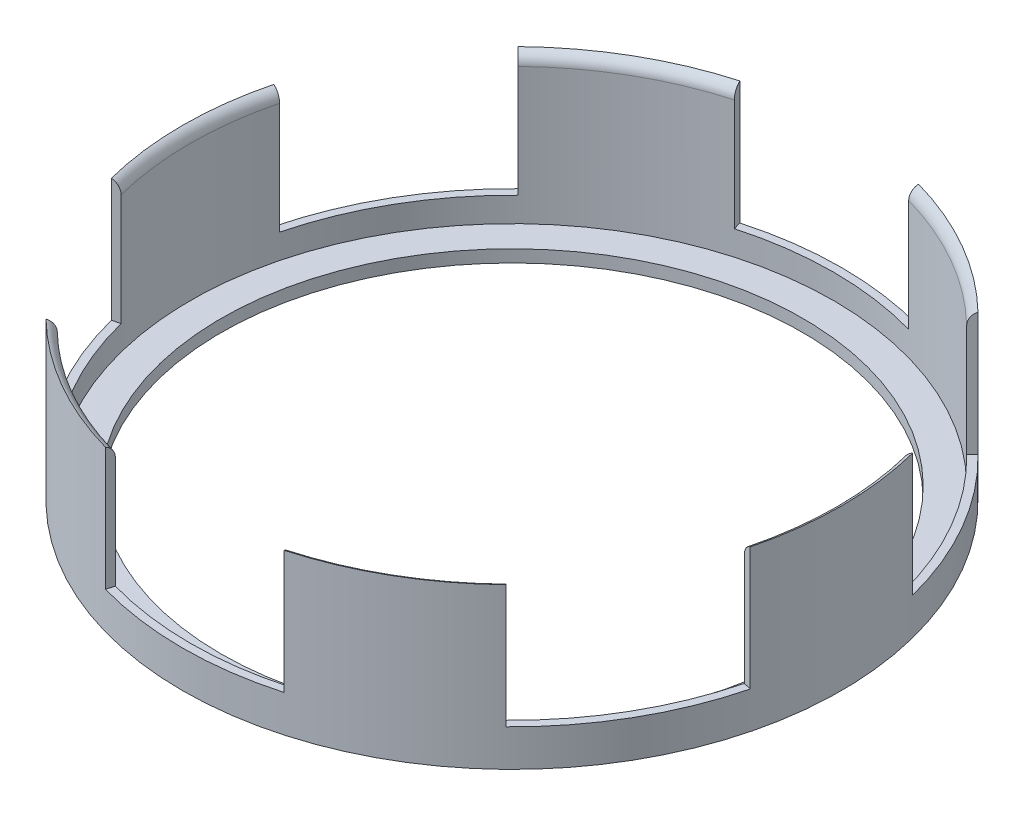
ISO-10303-21;
HEADER;
FILE_DESCRIPTION(('STEP AP214'),'2;1');
FILE_NAME('part.step','',(''),(''),'','','');
FILE_SCHEMA(('AUTOMOTIVE_DESIGN { 1 0 10303 214 1 1 1 1 }'));
ENDSEC;
DATA;
#1=APPLICATION_CONTEXT('core data for automotive mechanical design processes');
#2=APPLICATION_PROTOCOL_DEFINITION('international standard','automotive_design',2000,#1);
#3=PRODUCT_CONTEXT('',#1,'mechanical');
#4=PRODUCT('Part','Part','',(#3));
#5=PRODUCT_RELATED_PRODUCT_CATEGORY('part','',(#4));
#6=PRODUCT_DEFINITION_FORMATION('','',#4);
#7=PRODUCT_DEFINITION_CONTEXT('part definition',#1,'design');
#8=PRODUCT_DEFINITION('design','',#6,#7);
#9=PRODUCT_DEFINITION_SHAPE('','',#8);
#10=(LENGTH_UNIT() NAMED_UNIT(*) SI_UNIT(.MILLI.,.METRE.));
#11=(NAMED_UNIT(*) PLANE_ANGLE_UNIT() SI_UNIT($,.RADIAN.));
#12=(NAMED_UNIT(*) SI_UNIT($,.STERADIAN.) SOLID_ANGLE_UNIT());
#13=UNCERTAINTY_MEASURE_WITH_UNIT(LENGTH_MEASURE(1.E-05),#10,'distance_accuracy_value','');
#14=(GEOMETRIC_REPRESENTATION_CONTEXT(3) GLOBAL_UNCERTAINTY_ASSIGNED_CONTEXT((#13)) GLOBAL_UNIT_ASSIGNED_CONTEXT((#10,
#11,#12)) REPRESENTATION_CONTEXT('',''));
#15=CARTESIAN_POINT('',(0.,0.,0.));
#16=DIRECTION('',(0.,0.,1.));
#17=DIRECTION('',(1.,0.,0.));
#18=AXIS2_PLACEMENT_3D('',#15,#16,#17);
#19=CARTESIAN_POINT('',(26.775,3.,0.));
#20=DIRECTION('',(0.,1.,0.));
#21=DIRECTION('',(0.,0.,1.));
#22=AXIS2_PLACEMENT_3D('',#19,#20,#21);
#23=PLANE('',#22);
#24=CARTESIAN_POINT('',(0.,3.,0.));
#25=DIRECTION('',(0.,-1.,0.));
#26=DIRECTION('',(0.,0.,-1.));
#27=AXIS2_PLACEMENT_3D('',#24,#25,#26);
#28=CIRCLE('',#27,26.125);
#29=CARTESIAN_POINT('',(-7.08242283202688,3.,-25.1466680064852));
#30=VERTEX_POINT('',#29);
#31=CARTESIAN_POINT('',(7.0824228320274,3.00000000000001,-25.146668006485));
#32=VERTEX_POINT('',#31);
#33=EDGE_CURVE('E455',#30,#32,#28,.T.);
#34=ORIENTED_EDGE('',*,*,#33,.T.);
#35=DIRECTION('',(0.271097524670905,0.,-0.962551885415694));
#36=VECTOR('',#35,1.);
#37=CARTESIAN_POINT('',(1.96779831255908,3.,-6.98681398205641));
#38=LINE('',#37,#36);
#39=CARTESIAN_POINT('',(7.25863622306349,3.00000000000001,-25.7723267320052));
#40=VERTEX_POINT('',#39);
#41=EDGE_CURVE('E232',#32,#40,#38,.T.);
#42=ORIENTED_EDGE('',*,*,#41,.T.);
#43=CARTESIAN_POINT('',(0.,3.,0.));
#44=DIRECTION('',(0.,-1.,0.));
#45=DIRECTION('',(0.,0.,-1.));
#46=AXIS2_PLACEMENT_3D('',#43,#44,#45);
#47=CIRCLE('',#46,26.775);
#48=CARTESIAN_POINT('',(-7.25863622306295,3.00000000000001,-25.7723267320054));
#49=VERTEX_POINT('',#48);
#50=EDGE_CURVE('E214',#49,#40,#47,.T.);
#51=ORIENTED_EDGE('',*,*,#50,.F.);
#52=DIRECTION('',(0.271097524670886,0.,0.9625518854157));
#53=VECTOR('',#52,1.);
#54=CARTESIAN_POINT('',(1.96779831255883,3.,6.98681398205596));
#55=LINE('',#54,#53);
#56=EDGE_CURVE('E251',#49,#30,#55,.T.);
#57=ORIENTED_EDGE('',*,*,#56,.T.);
#58=EDGE_LOOP('',(#34,#42,#51,#57));
#59=FACE_BOUND('',#58,.T.);
#60=ADVANCED_FACE('F39',(#59),#23,.T.);
#61=CARTESIAN_POINT('',(18.690171553018,3.00000000000001,-19.1723267320051));
#62=VERTEX_POINT('',#61);
#63=CARTESIAN_POINT('',(25.948807776081,3.,-6.6));
#64=VERTEX_POINT('',#63);
#65=EDGE_CURVE('E371',#62,#64,#47,.T.);
#66=ORIENTED_EDGE('',*,*,#65,.F.);
#67=DIRECTION('',(-0.698045622895163,0.,0.716053285975914));
#68=VECTOR('',#67,1.);
#69=CARTESIAN_POINT('',(13.0465924437439,3.,-13.3831587559921));
#70=LINE('',#69,#68);
#71=CARTESIAN_POINT('',(18.2364418981361,3.,-18.7068920961207));
#72=VERTEX_POINT('',#71);
#73=EDGE_CURVE('E216',#62,#72,#70,.T.);
#74=ORIENTED_EDGE('',*,*,#73,.T.);
#75=CARTESIAN_POINT('',(25.318864730163,3.,-6.43977591036414));
#76=VERTEX_POINT('',#75);
#77=EDGE_CURVE('E366',#72,#76,#28,.T.);
#78=ORIENTED_EDGE('',*,*,#77,.T.);
#79=DIRECTION('',(0.969143147566049,0.,-0.246498599439776));
#80=VECTOR('',#79,1.);
#81=CARTESIAN_POINT('',(25.1481092436975,3.,-6.39634477393592));
#82=LINE('',#81,#80);
#83=EDGE_CURVE('E357',#76,#64,#82,.T.);
#84=ORIENTED_EDGE('',*,*,#83,.T.);
#85=EDGE_LOOP('',(#66,#74,#78,#84));
#86=FACE_BOUND('',#85,.T.);
#87=ADVANCED_FACE('F461',(#86),#23,.T.);
#88=CARTESIAN_POINT('',(-25.318864730163,3.,-6.43977591036415));
#89=VERTEX_POINT('',#88);
#90=CARTESIAN_POINT('',(-18.2364418981358,3.00000000000001,-18.7068920961211));
#91=VERTEX_POINT('',#90);
#92=EDGE_CURVE('E452',#89,#91,#28,.T.);
#93=ORIENTED_EDGE('',*,*,#92,.T.);
#94=DIRECTION('',(-0.698045622895148,0.,-0.716053285975928));
#95=VECTOR('',#94,1.);
#96=CARTESIAN_POINT('',(13.0465924437434,3.,13.3831587559921));
#97=LINE('',#96,#95);
#98=CARTESIAN_POINT('',(-18.6901715530176,3.00000000000001,-19.1723267320055));
#99=VERTEX_POINT('',#98);
#100=EDGE_CURVE('E255',#91,#99,#97,.T.);
#101=ORIENTED_EDGE('',*,*,#100,.T.);
#102=CARTESIAN_POINT('',(-25.948807776081,3.00000000000001,-6.6));
#103=VERTEX_POINT('',#102);
#104=EDGE_CURVE('E442',#103,#99,#47,.T.);
#105=ORIENTED_EDGE('',*,*,#104,.F.);
#106=DIRECTION('',(0.96914314756605,0.,0.246498599439775));
#107=VECTOR('',#106,1.);
#108=CARTESIAN_POINT('',(25.1481092436975,3.,6.39634477393587));
#109=LINE('',#108,#107);
#110=EDGE_CURVE('E276',#103,#89,#109,.T.);
#111=ORIENTED_EDGE('',*,*,#110,.T.);
#112=EDGE_LOOP('',(#93,#101,#105,#111));
#113=FACE_BOUND('',#112,.T.);
#114=ADVANCED_FACE('F535',(#113),#23,.T.);
#115=CARTESIAN_POINT('',(-18.236441898136,3.,18.7068920961209));
#116=VERTEX_POINT('',#115);
#117=CARTESIAN_POINT('',(-25.318864730163,3.00000000000001,6.43977591036414));
#118=VERTEX_POINT('',#117);
#119=EDGE_CURVE('E449',#116,#118,#28,.T.);
#120=ORIENTED_EDGE('',*,*,#119,.T.);
#121=DIRECTION('',(-0.969143147566049,0.,0.246498599439776));
#122=VECTOR('',#121,1.);
#123=CARTESIAN_POINT('',(25.1481092436975,3.,-6.39634477393593));
#124=LINE('',#123,#122);
#125=CARTESIAN_POINT('',(-25.948807776081,3.00000000000001,6.6));
#126=VERTEX_POINT('',#125);
#127=EDGE_CURVE('E280',#118,#126,#124,.T.);
#128=ORIENTED_EDGE('',*,*,#127,.T.);
#129=CARTESIAN_POINT('',(-18.6901715530179,3.00000000000001,19.1723267320052));
#130=VERTEX_POINT('',#129);
#131=EDGE_CURVE('E439',#130,#126,#47,.T.);
#132=ORIENTED_EDGE('',*,*,#131,.F.);
#133=DIRECTION('',(0.698045622895158,0.,-0.716053285975919));
#134=VECTOR('',#133,1.);
#135=CARTESIAN_POINT('',(13.0465924437437,3.,-13.3831587559921));
#136=LINE('',#135,#134);
#137=EDGE_CURVE('E301',#130,#116,#136,.T.);
#138=ORIENTED_EDGE('',*,*,#137,.T.);
#139=EDGE_LOOP('',(#120,#128,#132,#138));
#140=FACE_BOUND('',#139,.T.);
#141=ADVANCED_FACE('F517',(#140),#23,.T.);
#142=CARTESIAN_POINT('',(7.08242283202705,3.,25.1466680064851));
#143=VERTEX_POINT('',#142);
#144=CARTESIAN_POINT('',(-7.08242283202723,3.00000000000001,25.1466680064851));
#145=VERTEX_POINT('',#144);
#146=EDGE_CURVE('E372',#143,#145,#28,.T.);
#147=ORIENTED_EDGE('',*,*,#146,.T.);
#148=DIRECTION('',(-0.271097524670898,0.,0.962551885415696));
#149=VECTOR('',#148,1.);
#150=CARTESIAN_POINT('',(1.96779831255898,3.,-6.98681398205626));
#151=LINE('',#150,#149);
#152=CARTESIAN_POINT('',(-7.25863622306331,3.00000000000001,25.7723267320053));
#153=VERTEX_POINT('',#152);
#154=EDGE_CURVE('E305',#145,#153,#151,.T.);
#155=ORIENTED_EDGE('',*,*,#154,.T.);
#156=CARTESIAN_POINT('',(7.25863622306313,3.,25.7723267320053));
#157=VERTEX_POINT('',#156);
#158=EDGE_CURVE('E378',#157,#153,#47,.T.);
#159=ORIENTED_EDGE('',*,*,#158,.F.);
#160=DIRECTION('',(-0.271097524670893,0.,-0.962551885415698));
#161=VECTOR('',#160,1.);
#162=CARTESIAN_POINT('',(1.96779831255887,3.,6.98681398205613));
#163=LINE('',#162,#161);
#164=EDGE_CURVE('E326',#157,#143,#163,.T.);
#165=ORIENTED_EDGE('',*,*,#164,.T.);
#166=EDGE_LOOP('',(#147,#155,#159,#165));
#167=FACE_BOUND('',#166,.T.);
#168=ADVANCED_FACE('F499',(#167),#23,.T.);
#169=CARTESIAN_POINT('',(25.318864730163,3.,6.43977591036415));
#170=VERTEX_POINT('',#169);
#171=CARTESIAN_POINT('',(18.2364418981359,3.,18.706892096121));
#172=VERTEX_POINT('',#171);
#173=EDGE_CURVE('E367',#170,#172,#28,.T.);
#174=ORIENTED_EDGE('',*,*,#173,.T.);
#175=DIRECTION('',(0.698045622895153,0.,0.716053285975923));
#176=VECTOR('',#175,1.);
#177=CARTESIAN_POINT('',(13.0465924437435,3.,13.3831587559921));
#178=LINE('',#177,#176);
#179=CARTESIAN_POINT('',(18.6901715530177,3.,19.1723267320053));
#180=VERTEX_POINT('',#179);
#181=EDGE_CURVE('E330',#172,#180,#178,.T.);
#182=ORIENTED_EDGE('',*,*,#181,.T.);
#183=CARTESIAN_POINT('',(25.948807776081,3.,6.6));
#184=VERTEX_POINT('',#183);
#185=EDGE_CURVE('E373',#184,#180,#47,.T.);
#186=ORIENTED_EDGE('',*,*,#185,.F.);
#187=DIRECTION('',(-0.96914314756605,0.,-0.246498599439775));
#188=VECTOR('',#187,1.);
#189=CARTESIAN_POINT('',(25.1481092436975,3.,6.39634477393593));
#190=LINE('',#189,#188);
#191=EDGE_CURVE('E353',#184,#170,#190,.T.);
#192=ORIENTED_EDGE('',*,*,#191,.T.);
#193=EDGE_LOOP('',(#174,#182,#186,#192));
#194=FACE_BOUND('',#193,.T.);
#195=ADVANCED_FACE('F481',(#194),#23,.T.);
#196=CARTESIAN_POINT('',(0.,1.,0.));
#197=DIRECTION('',(0.,1.,0.));
#198=DIRECTION('',(0.,0.,1.));
#199=AXIS2_PLACEMENT_3D('',#196,#197,#198);
#200=PLANE('',#199);
#201=CARTESIAN_POINT('',(0.,1.,0.));
#202=DIRECTION('',(0.,1.,0.));
#203=DIRECTION('',(0.,0.,1.));
#204=AXIS2_PLACEMENT_3D('',#201,#202,#203);
#205=CIRCLE('',#204,23.625);
#206=CARTESIAN_POINT('',(0.,1.,23.625));
#207=VERTEX_POINT('',#206);
#208=EDGE_CURVE('E362',#207,#207,#205,.T.);
#209=ORIENTED_EDGE('',*,*,#208,.F.);
#210=EDGE_LOOP('',(#209));
#211=FACE_BOUND('',#210,.T.);
#212=CARTESIAN_POINT('',(0.,1.,0.));
#213=DIRECTION('',(0.,1.,0.));
#214=DIRECTION('',(0.,0.,1.));
#215=AXIS2_PLACEMENT_3D('',#212,#213,#214);
#216=CIRCLE('',#215,26.125);
#217=CARTESIAN_POINT('',(0.,1.,26.125));
#218=VERTEX_POINT('',#217);
#219=EDGE_CURVE('E382',#218,#218,#216,.F.);
#220=ORIENTED_EDGE('',*,*,#219,.F.);
#221=EDGE_LOOP('',(#220));
#222=FACE_BOUND('',#221,.T.);
#223=ADVANCED_FACE('F560',(#211,#222),#200,.T.);
#224=CARTESIAN_POINT('',(0.,0.,0.));
#225=DIRECTION('',(0.,-1.,0.));
#226=DIRECTION('',(0.,0.,-1.));
#227=AXIS2_PLACEMENT_3D('',#224,#225,#226);
#228=CYLINDRICAL_SURFACE('',#227,26.125);
#229=DIRECTION('',(0.,-1.,0.));
#230=VECTOR('',#229,1.);
#231=CARTESIAN_POINT('',(18.2364418981361,13.,-18.7068920961207));
#232=LINE('',#231,#230);
#233=CARTESIAN_POINT('',(18.2364418981361,12.0632503002402,-18.7068920961207));
#234=VERTEX_POINT('',#233);
#235=EDGE_CURVE('E222',#234,#72,#232,.T.);
#236=ORIENTED_EDGE('',*,*,#235,.F.);
#237=CARTESIAN_POINT('',(0.,12.0632503002402,0.));
#238=DIRECTION('',(0.,1.,0.));
#239=DIRECTION('',(0.,0.,1.));
#240=AXIS2_PLACEMENT_3D('',#237,#238,#239);
#241=CIRCLE('',#240,26.125);
#242=CARTESIAN_POINT('',(7.0824228320274,12.0632503002402,-25.146668006485));
#243=VERTEX_POINT('',#242);
#244=EDGE_CURVE('E48',#234,#243,#241,.T.);
#245=ORIENTED_EDGE('',*,*,#244,.T.);
#246=DIRECTION('',(0.,-1.,0.));
#247=VECTOR('',#246,1.);
#248=CARTESIAN_POINT('',(7.0824228320274,13.,-25.146668006485));
#249=LINE('',#248,#247);
#250=EDGE_CURVE('E203',#243,#32,#249,.T.);
#251=ORIENTED_EDGE('',*,*,#250,.T.);
#252=ORIENTED_EDGE('',*,*,#33,.F.);
#253=DIRECTION('',(0.,-1.,0.));
#254=VECTOR('',#253,1.);
#255=CARTESIAN_POINT('',(-7.08242283202688,13.,-25.1466680064852));
#256=LINE('',#255,#254);
#257=CARTESIAN_POINT('',(-7.08242283202688,12.0632503002402,-25.1466680064852));
#258=VERTEX_POINT('',#257);
#259=EDGE_CURVE('E242',#258,#30,#256,.T.);
#260=ORIENTED_EDGE('',*,*,#259,.F.);
#261=CARTESIAN_POINT('',(0.,12.0632503002402,0.));
#262=DIRECTION('',(0.,1.,0.));
#263=DIRECTION('',(0.,0.,1.));
#264=AXIS2_PLACEMENT_3D('',#261,#262,#263);
#265=CIRCLE('',#264,26.125);
#266=CARTESIAN_POINT('',(-18.2364418981358,12.0632503002402,-18.7068920961211));
#267=VERTEX_POINT('',#266);
#268=EDGE_CURVE('E428',#258,#267,#265,.T.);
#269=ORIENTED_EDGE('',*,*,#268,.T.);
#270=DIRECTION('',(0.,-1.,0.));
#271=VECTOR('',#270,1.);
#272=CARTESIAN_POINT('',(-18.2364418981358,13.,-18.7068920961211));
#273=LINE('',#272,#271);
#274=EDGE_CURVE('E245',#267,#91,#273,.T.);
#275=ORIENTED_EDGE('',*,*,#274,.T.);
#276=ORIENTED_EDGE('',*,*,#92,.F.);
#277=DIRECTION('',(0.,-1.,0.));
#278=VECTOR('',#277,1.);
#279=CARTESIAN_POINT('',(-25.318864730163,13.,-6.43977591036414));
#280=LINE('',#279,#278);
#281=CARTESIAN_POINT('',(-25.318864730163,12.0632503002402,-6.43977591036414));
#282=VERTEX_POINT('',#281);
#283=EDGE_CURVE('E267',#282,#89,#280,.T.);
#284=ORIENTED_EDGE('',*,*,#283,.F.);
#285=CARTESIAN_POINT('',(0.,12.0632503002402,0.));
#286=DIRECTION('',(0.,1.,0.));
#287=DIRECTION('',(0.,0.,1.));
#288=AXIS2_PLACEMENT_3D('',#285,#286,#287);
#289=CIRCLE('',#288,26.125);
#290=CARTESIAN_POINT('',(-25.318864730163,12.0632503002402,6.43977591036415));
#291=VERTEX_POINT('',#290);
#292=EDGE_CURVE('E419',#282,#291,#289,.T.);
#293=ORIENTED_EDGE('',*,*,#292,.T.);
#294=DIRECTION('',(0.,-1.,0.));
#295=VECTOR('',#294,1.);
#296=CARTESIAN_POINT('',(-25.318864730163,13.,6.43977591036414));
#297=LINE('',#296,#295);
#298=EDGE_CURVE('E270',#291,#118,#297,.T.);
#299=ORIENTED_EDGE('',*,*,#298,.T.);
#300=ORIENTED_EDGE('',*,*,#119,.F.);
#301=DIRECTION('',(0.,-1.,0.));
#302=VECTOR('',#301,1.);
#303=CARTESIAN_POINT('',(-18.236441898136,13.,18.7068920961209));
#304=LINE('',#303,#302);
#305=CARTESIAN_POINT('',(-18.236441898136,12.0632503002402,18.7068920961209));
#306=VERTEX_POINT('',#305);
#307=EDGE_CURVE('E292',#306,#116,#304,.T.);
#308=ORIENTED_EDGE('',*,*,#307,.F.);
#309=CARTESIAN_POINT('',(0.,12.0632503002402,0.));
#310=DIRECTION('',(0.,1.,0.));
#311=DIRECTION('',(0.,0.,1.));
#312=AXIS2_PLACEMENT_3D('',#309,#310,#311);
#313=CIRCLE('',#312,26.125);
#314=CARTESIAN_POINT('',(-7.08242283202722,12.0632503002402,25.1466680064851));
#315=VERTEX_POINT('',#314);
#316=EDGE_CURVE('E410',#306,#315,#313,.T.);
#317=ORIENTED_EDGE('',*,*,#316,.T.);
#318=DIRECTION('',(0.,-1.,0.));
#319=VECTOR('',#318,1.);
#320=CARTESIAN_POINT('',(-7.08242283202723,13.,25.1466680064851));
#321=LINE('',#320,#319);
#322=EDGE_CURVE('E295',#315,#145,#321,.T.);
#323=ORIENTED_EDGE('',*,*,#322,.T.);
#324=ORIENTED_EDGE('',*,*,#146,.F.);
#325=DIRECTION('',(0.,-1.,0.));
#326=VECTOR('',#325,1.);
#327=CARTESIAN_POINT('',(7.08242283202705,13.,25.1466680064851));
#328=LINE('',#327,#326);
#329=CARTESIAN_POINT('',(7.08242283202705,12.0632503002402,25.1466680064851));
#330=VERTEX_POINT('',#329);
#331=EDGE_CURVE('E317',#330,#143,#328,.T.);
#332=ORIENTED_EDGE('',*,*,#331,.F.);
#333=CARTESIAN_POINT('',(0.,12.0632503002402,0.));
#334=DIRECTION('',(0.,1.,0.));
#335=DIRECTION('',(0.,0.,1.));
#336=AXIS2_PLACEMENT_3D('',#333,#334,#335);
#337=CIRCLE('',#336,26.125);
#338=CARTESIAN_POINT('',(18.2364418981359,12.0632503002402,18.706892096121));
#339=VERTEX_POINT('',#338);
#340=EDGE_CURVE('E401',#330,#339,#337,.T.);
#341=ORIENTED_EDGE('',*,*,#340,.T.);
#342=DIRECTION('',(0.,-1.,0.));
#343=VECTOR('',#342,1.);
#344=CARTESIAN_POINT('',(18.2364418981359,13.,18.706892096121));
#345=LINE('',#344,#343);
#346=EDGE_CURVE('E320',#339,#172,#345,.T.);
#347=ORIENTED_EDGE('',*,*,#346,.T.);
#348=ORIENTED_EDGE('',*,*,#173,.F.);
#349=DIRECTION('',(0.,-1.,0.));
#350=VECTOR('',#349,1.);
#351=CARTESIAN_POINT('',(25.318864730163,13.,6.43977591036414));
#352=LINE('',#351,#350);
#353=CARTESIAN_POINT('',(25.318864730163,12.0632503002402,6.43977591036414));
#354=VERTEX_POINT('',#353);
#355=EDGE_CURVE('E342',#354,#170,#352,.T.);
#356=ORIENTED_EDGE('',*,*,#355,.F.);
#357=CARTESIAN_POINT('',(0.,12.0632503002402,0.));
#358=DIRECTION('',(0.,1.,0.));
#359=DIRECTION('',(0.,0.,1.));
#360=AXIS2_PLACEMENT_3D('',#357,#358,#359);
#361=CIRCLE('',#360,26.125);
#362=CARTESIAN_POINT('',(25.318864730163,12.0632503002402,-6.43977591036415));
#363=VERTEX_POINT('',#362);
#364=EDGE_CURVE('E392',#354,#363,#361,.T.);
#365=ORIENTED_EDGE('',*,*,#364,.T.);
#366=DIRECTION('',(0.,-1.,0.));
#367=VECTOR('',#366,1.);
#368=CARTESIAN_POINT('',(25.318864730163,13.,-6.43977591036414));
#369=LINE('',#368,#367);
#370=EDGE_CURVE('E345',#363,#76,#369,.T.);
#371=ORIENTED_EDGE('',*,*,#370,.T.);
#372=ORIENTED_EDGE('',*,*,#77,.F.);
#373=EDGE_LOOP('',(#236,#245,#251,#252,#260,#269,#275,#276,#284,#293,#299,#300,#308,#317,#323,
#324,#332,#341,#347,#348,#356,#365,#371,#372));
#374=FACE_BOUND('',#373,.T.);
#375=ORIENTED_EDGE('',*,*,#219,.T.);
#376=EDGE_LOOP('',(#375));
#377=FACE_BOUND('',#376,.T.);
#378=ADVANCED_FACE('F464',(#374,#377),#228,.F.);
#379=CARTESIAN_POINT('',(0.,0.,0.));
#380=DIRECTION('',(0.,-1.,0.));
#381=DIRECTION('',(0.,0.,-1.));
#382=AXIS2_PLACEMENT_3D('',#379,#380,#381);
#383=CYLINDRICAL_SURFACE('',#382,26.775);
#384=CARTESIAN_POINT('',(0.,0.,0.));
#385=DIRECTION('',(0.,-1.,0.));
#386=DIRECTION('',(0.,0.,-1.));
#387=AXIS2_PLACEMENT_3D('',#384,#385,#386);
#388=CIRCLE('',#387,26.775);
#389=CARTESIAN_POINT('',(0.,0.,-26.775));
#390=VERTEX_POINT('',#389);
#391=EDGE_CURVE('E377',#390,#390,#388,.T.);
#392=ORIENTED_EDGE('',*,*,#391,.F.);
#393=EDGE_LOOP('',(#392));
#394=FACE_BOUND('',#393,.T.);
#395=ORIENTED_EDGE('',*,*,#50,.T.);
#396=DIRECTION('',(0.,-1.,0.));
#397=VECTOR('',#396,1.);
#398=CARTESIAN_POINT('',(7.25863622306349,13.,-25.7723267320052));
#399=LINE('',#398,#397);
#400=CARTESIAN_POINT('',(7.25863622306349,13.,-25.7723267320052));
#401=VERTEX_POINT('',#400);
#402=EDGE_CURVE('E201',#401,#40,#399,.T.);
#403=ORIENTED_EDGE('',*,*,#402,.F.);
#404=CARTESIAN_POINT('',(0.,13.,0.));
#405=DIRECTION('',(0.,1.,0.));
#406=DIRECTION('',(-0.866025403784433,0.,-0.50000000000001));
#407=AXIS2_PLACEMENT_3D('',#404,#405,#406);
#408=CIRCLE('',#407,26.775);
#409=CARTESIAN_POINT('',(18.690171553018,13.,-19.1723267320051));
#410=VERTEX_POINT('',#409);
#411=EDGE_CURVE('E211',#410,#401,#408,.T.);
#412=ORIENTED_EDGE('',*,*,#411,.F.);
#413=DIRECTION('',(0.,-1.,0.));
#414=VECTOR('',#413,1.);
#415=CARTESIAN_POINT('',(18.690171553018,13.,-19.1723267320051));
#416=LINE('',#415,#414);
#417=EDGE_CURVE('E219',#410,#62,#416,.T.);
#418=ORIENTED_EDGE('',*,*,#417,.T.);
#419=ORIENTED_EDGE('',*,*,#65,.T.);
#420=DIRECTION('',(0.,-1.,0.));
#421=VECTOR('',#420,1.);
#422=CARTESIAN_POINT('',(25.948807776081,13.,-6.6));
#423=LINE('',#422,#421);
#424=CARTESIAN_POINT('',(25.948807776081,13.,-6.6));
#425=VERTEX_POINT('',#424);
#426=EDGE_CURVE('E349',#425,#64,#423,.T.);
#427=ORIENTED_EDGE('',*,*,#426,.F.);
#428=CARTESIAN_POINT('',(0.,13.,0.));
#429=DIRECTION('',(0.,1.,0.));
#430=DIRECTION('',(0.,0.,-1.));
#431=AXIS2_PLACEMENT_3D('',#428,#429,#430);
#432=CIRCLE('',#431,26.775);
#433=CARTESIAN_POINT('',(25.948807776081,13.,6.6));
#434=VERTEX_POINT('',#433);
#435=EDGE_CURVE('E334',#434,#425,#432,.T.);
#436=ORIENTED_EDGE('',*,*,#435,.F.);
#437=DIRECTION('',(0.,-1.,0.));
#438=VECTOR('',#437,1.);
#439=CARTESIAN_POINT('',(25.948807776081,13.,6.6));
#440=LINE('',#439,#438);
#441=EDGE_CURVE('E338',#434,#184,#440,.T.);
#442=ORIENTED_EDGE('',*,*,#441,.T.);
#443=ORIENTED_EDGE('',*,*,#185,.T.);
#444=DIRECTION('',(0.,-1.,0.));
#445=VECTOR('',#444,1.);
#446=CARTESIAN_POINT('',(18.6901715530177,13.,19.1723267320053));
#447=LINE('',#446,#445);
#448=CARTESIAN_POINT('',(18.6901715530177,13.,19.1723267320053));
#449=VERTEX_POINT('',#448);
#450=EDGE_CURVE('E323',#449,#180,#447,.T.);
#451=ORIENTED_EDGE('',*,*,#450,.F.);
#452=CARTESIAN_POINT('',(0.,13.,0.));
#453=DIRECTION('',(0.,1.,0.));
#454=DIRECTION('',(0.86602540378444,0.,-0.499999999999998));
#455=AXIS2_PLACEMENT_3D('',#452,#453,#454);
#456=CIRCLE('',#455,26.775);
#457=CARTESIAN_POINT('',(7.25863622306313,13.,25.7723267320053));
#458=VERTEX_POINT('',#457);
#459=EDGE_CURVE('E309',#458,#449,#456,.T.);
#460=ORIENTED_EDGE('',*,*,#459,.F.);
#461=DIRECTION('',(0.,-1.,0.));
#462=VECTOR('',#461,1.);
#463=CARTESIAN_POINT('',(7.25863622306313,13.,25.7723267320053));
#464=LINE('',#463,#462);
#465=EDGE_CURVE('E313',#458,#157,#464,.T.);
#466=ORIENTED_EDGE('',*,*,#465,.T.);
#467=ORIENTED_EDGE('',*,*,#158,.T.);
#468=DIRECTION('',(0.,-1.,0.));
#469=VECTOR('',#468,1.);
#470=CARTESIAN_POINT('',(-7.25863622306331,13.,25.7723267320053));
#471=LINE('',#470,#469);
#472=CARTESIAN_POINT('',(-7.25863622306331,13.,25.7723267320053));
#473=VERTEX_POINT('',#472);
#474=EDGE_CURVE('E298',#473,#153,#471,.T.);
#475=ORIENTED_EDGE('',*,*,#474,.F.);
#476=CARTESIAN_POINT('',(0.,13.,0.));
#477=DIRECTION('',(0.,1.,0.));
#478=DIRECTION('',(0.866025403784436,0.,0.500000000000004));
#479=AXIS2_PLACEMENT_3D('',#476,#477,#478);
#480=CIRCLE('',#479,26.775);
#481=CARTESIAN_POINT('',(-18.6901715530179,13.,19.1723267320052));
#482=VERTEX_POINT('',#481);
#483=EDGE_CURVE('E284',#482,#473,#480,.T.);
#484=ORIENTED_EDGE('',*,*,#483,.F.);
#485=DIRECTION('',(0.,-1.,0.));
#486=VECTOR('',#485,1.);
#487=CARTESIAN_POINT('',(-18.6901715530179,13.,19.1723267320052));
#488=LINE('',#487,#486);
#489=EDGE_CURVE('E288',#482,#130,#488,.T.);
#490=ORIENTED_EDGE('',*,*,#489,.T.);
#491=ORIENTED_EDGE('',*,*,#131,.T.);
#492=DIRECTION('',(0.,-1.,0.));
#493=VECTOR('',#492,1.);
#494=CARTESIAN_POINT('',(-25.948807776081,13.,6.6));
#495=LINE('',#494,#493);
#496=CARTESIAN_POINT('',(-25.948807776081,13.,6.6));
#497=VERTEX_POINT('',#496);
#498=EDGE_CURVE('E273',#497,#126,#495,.T.);
#499=ORIENTED_EDGE('',*,*,#498,.F.);
#500=CARTESIAN_POINT('',(0.,13.,0.));
#501=DIRECTION('',(0.,1.,0.));
#502=DIRECTION('',(0.,0.,1.));
#503=AXIS2_PLACEMENT_3D('',#500,#501,#502);
#504=CIRCLE('',#503,26.775);
#505=CARTESIAN_POINT('',(-25.948807776081,13.,-6.6));
#506=VERTEX_POINT('',#505);
#507=EDGE_CURVE('E259',#506,#497,#504,.T.);
#508=ORIENTED_EDGE('',*,*,#507,.F.);
#509=DIRECTION('',(0.,-1.,0.));
#510=VECTOR('',#509,1.);
#511=CARTESIAN_POINT('',(-25.948807776081,13.,-6.6));
#512=LINE('',#511,#510);
#513=EDGE_CURVE('E263',#506,#103,#512,.T.);
#514=ORIENTED_EDGE('',*,*,#513,.T.);
#515=ORIENTED_EDGE('',*,*,#104,.T.);
#516=DIRECTION('',(0.,-1.,0.));
#517=VECTOR('',#516,1.);
#518=CARTESIAN_POINT('',(-18.6901715530176,13.,-19.1723267320055));
#519=LINE('',#518,#517);
#520=CARTESIAN_POINT('',(-18.6901715530176,13.,-19.1723267320055));
#521=VERTEX_POINT('',#520);
#522=EDGE_CURVE('E248',#521,#99,#519,.T.);
#523=ORIENTED_EDGE('',*,*,#522,.F.);
#524=CARTESIAN_POINT('',(0.,13.,0.));
#525=DIRECTION('',(0.,1.,0.));
#526=DIRECTION('',(-0.866025403784443,0.,0.499999999999992));
#527=AXIS2_PLACEMENT_3D('',#524,#525,#526);
#528=CIRCLE('',#527,26.775);
#529=CARTESIAN_POINT('',(-7.25863622306295,13.,-25.7723267320054));
#530=VERTEX_POINT('',#529);
#531=EDGE_CURVE('E235',#530,#521,#528,.T.);
#532=ORIENTED_EDGE('',*,*,#531,.F.);
#533=DIRECTION('',(0.,-1.,0.));
#534=VECTOR('',#533,1.);
#535=CARTESIAN_POINT('',(-7.25863622306295,13.,-25.7723267320054));
#536=LINE('',#535,#534);
#537=EDGE_CURVE('E239',#530,#49,#536,.T.);
#538=ORIENTED_EDGE('',*,*,#537,.T.);
#539=EDGE_LOOP('',(#395,#403,#412,#418,#419,#427,#436,#442,#443,#451,#460,#466,#467,#475,#484,
#490,#491,#499,#508,#514,#515,#523,#532,#538));
#540=FACE_BOUND('',#539,.T.);
#541=ADVANCED_FACE('F209',(#394,#540),#383,.T.);
#542=CARTESIAN_POINT('',(0.,0.,0.));
#543=DIRECTION('',(0.,1.,0.));
#544=DIRECTION('',(0.,0.,1.));
#545=AXIS2_PLACEMENT_3D('',#542,#543,#544);
#546=PLANE('',#545);
#547=ORIENTED_EDGE('',*,*,#391,.T.);
#548=EDGE_LOOP('',(#547));
#549=FACE_BOUND('',#548,.T.);
#550=CARTESIAN_POINT('',(0.,0.,0.));
#551=DIRECTION('',(0.,1.,0.));
#552=DIRECTION('',(0.,0.,1.));
#553=AXIS2_PLACEMENT_3D('',#550,#551,#552);
#554=CIRCLE('',#553,23.625);
#555=CARTESIAN_POINT('',(0.,0.,23.625));
#556=VERTEX_POINT('',#555);
#557=EDGE_CURVE('E361',#556,#556,#554,.T.);
#558=ORIENTED_EDGE('',*,*,#557,.T.);
#559=EDGE_LOOP('',(#558));
#560=FACE_BOUND('',#559,.T.);
#561=ADVANCED_FACE('F620',(#549,#560),#546,.F.);
#562=CARTESIAN_POINT('',(0.,-1.2E-05,0.));
#563=DIRECTION('',(0.,1.,0.));
#564=DIRECTION('',(0.,0.,1.));
#565=AXIS2_PLACEMENT_3D('',#562,#563,#564);
#566=CYLINDRICAL_SURFACE('',#565,23.625);
#567=CARTESIAN_POINT('',(0.,1.,23.625));
#568=CARTESIAN_POINT('',(0.,0.989583333333333,23.625));
#569=CARTESIAN_POINT('',(0.,0.979166666666667,23.625));
#570=CARTESIAN_POINT('',(0.,0.958333333333333,23.625));
#571=CARTESIAN_POINT('',(0.,0.947916666666667,23.625));
#572=CARTESIAN_POINT('',(0.,0.927083333333333,23.625));
#573=CARTESIAN_POINT('',(0.,0.916666666666667,23.625));
#574=CARTESIAN_POINT('',(0.,0.895833333333333,23.625));
#575=CARTESIAN_POINT('',(0.,0.885416666666667,23.625));
#576=CARTESIAN_POINT('',(0.,0.864583333333333,23.625));
#577=CARTESIAN_POINT('',(0.,0.854166666666667,23.625));
#578=CARTESIAN_POINT('',(0.,0.833333333333333,23.625));
#579=CARTESIAN_POINT('',(0.,0.822916666666667,23.625));
#580=CARTESIAN_POINT('',(0.,0.802083333333333,23.625));
#581=CARTESIAN_POINT('',(0.,0.791666666666667,23.625));
#582=CARTESIAN_POINT('',(0.,0.770833333333333,23.625));
#583=CARTESIAN_POINT('',(0.,0.760416666666667,23.625));
#584=CARTESIAN_POINT('',(0.,0.739583333333333,23.625));
#585=CARTESIAN_POINT('',(0.,0.729166666666667,23.625));
#586=CARTESIAN_POINT('',(0.,0.708333333333333,23.625));
#587=CARTESIAN_POINT('',(0.,0.697916666666667,23.625));
#588=CARTESIAN_POINT('',(0.,0.677083333333333,23.625));
#589=CARTESIAN_POINT('',(0.,0.666666666666667,23.625));
#590=CARTESIAN_POINT('',(0.,0.645833333333333,23.625));
#591=CARTESIAN_POINT('',(0.,0.635416666666667,23.625));
#592=CARTESIAN_POINT('',(0.,0.614583333333333,23.625));
#593=CARTESIAN_POINT('',(0.,0.604166666666667,23.625));
#594=CARTESIAN_POINT('',(0.,0.583333333333333,23.625));
#595=CARTESIAN_POINT('',(0.,0.572916666666667,23.625));
#596=CARTESIAN_POINT('',(0.,0.552083333333333,23.625));
#597=CARTESIAN_POINT('',(0.,0.541666666666667,23.625));
#598=CARTESIAN_POINT('',(0.,0.520833333333333,23.625));
#599=CARTESIAN_POINT('',(0.,0.510416666666667,23.625));
#600=CARTESIAN_POINT('',(0.,0.489583333333333,23.625));
#601=CARTESIAN_POINT('',(0.,0.479166666666667,23.625));
#602=CARTESIAN_POINT('',(0.,0.458333333333333,23.625));
#603=CARTESIAN_POINT('',(0.,0.447916666666667,23.625));
#604=CARTESIAN_POINT('',(0.,0.427083333333333,23.625));
#605=CARTESIAN_POINT('',(0.,0.416666666666667,23.625));
#606=CARTESIAN_POINT('',(0.,0.395833333333333,23.625));
#607=CARTESIAN_POINT('',(0.,0.385416666666667,23.625));
#608=CARTESIAN_POINT('',(0.,0.364583333333333,23.625));
#609=CARTESIAN_POINT('',(0.,0.354166666666667,23.625));
#610=CARTESIAN_POINT('',(0.,0.333333333333333,23.625));
#611=CARTESIAN_POINT('',(0.,0.322916666666667,23.625));
#612=CARTESIAN_POINT('',(0.,0.302083333333333,23.625));
#613=CARTESIAN_POINT('',(0.,0.291666666666667,23.625));
#614=CARTESIAN_POINT('',(0.,0.270833333333333,23.625));
#615=CARTESIAN_POINT('',(0.,0.260416666666667,23.625));
#616=CARTESIAN_POINT('',(0.,0.239583333333333,23.625));
#617=CARTESIAN_POINT('',(0.,0.229166666666667,23.625));
#618=CARTESIAN_POINT('',(0.,0.208333333333333,23.625));
#619=CARTESIAN_POINT('',(0.,0.197916666666667,23.625));
#620=CARTESIAN_POINT('',(0.,0.177083333333333,23.625));
#621=CARTESIAN_POINT('',(0.,0.166666666666667,23.625));
#622=CARTESIAN_POINT('',(0.,0.145833333333333,23.625));
#623=CARTESIAN_POINT('',(0.,0.135416666666667,23.625));
#624=CARTESIAN_POINT('',(0.,0.114583333333333,23.625));
#625=CARTESIAN_POINT('',(0.,0.104166666666667,23.625));
#626=CARTESIAN_POINT('',(0.,0.0833333333333333,23.625));
#627=CARTESIAN_POINT('',(0.,0.0729166666666667,23.625));
#628=CARTESIAN_POINT('',(0.,0.0520833333333333,23.625));
#629=CARTESIAN_POINT('',(0.,0.0416666666666667,23.625));
#630=CARTESIAN_POINT('',(0.,0.0208333333333333,23.625));
#631=CARTESIAN_POINT('',(0.,0.0104166666666666,23.625));
#632=CARTESIAN_POINT('',(0.,0.,23.625));
#633=B_SPLINE_CURVE_WITH_KNOTS('',3,(#567,#568,#569,#570,#571,#572,#573,#574,#575,#576,#577,
#578,#579,#580,#581,#582,#583,#584,#585,#586,#587,#588,#589,#590,#591,#592,#593,#594,#595,#596,
#597,#598,#599,#600,#601,#602,#603,#604,#605,#606,#607,#608,#609,#610,#611,#612,#613,#614,#615,
#616,#617,#618,#619,#620,#621,#622,#623,#624,#625,#626,#627,#628,#629,#630,#631,#632),
.UNSPECIFIED.,.F.,.F.,(4,2,2,2,2,2,2,2,2,2,2,2,2,2,2,2,2,2,2,2,2,2,2,2,2,2,2,2,2,2,2,2,4),(0.,
0.0312499999999999,0.0624999999999999,0.09375,0.125,0.15625,0.1875,0.21875,0.25,0.28125,0.3125,
0.34375,0.375,0.40625,0.4375,0.46875,0.5,0.53125,0.5625,0.59375,0.625,0.65625,0.6875,0.71875,
0.75,0.78125,0.8125,0.84375,0.875,0.90625,0.9375,0.96875,1.),.UNSPECIFIED.);
#634=EDGE_CURVE('BSEAM611',#207,#556,#633,.T.);
#635=ORIENTED_EDGE('',*,*,#208,.T.);
#636=ORIENTED_EDGE('',*,*,#557,.F.);
#637=ORIENTED_EDGE('',*,*,#634,.T.);
#638=ORIENTED_EDGE('',*,*,#634,.F.);
#639=EDGE_LOOP('',(#635,#637,#636,#638));
#640=FACE_BOUND('',#639,.T.);
#641=ADVANCED_FACE('F611',(#640),#566,.F.);
#642=CARTESIAN_POINT('',(25.948807776081,13.,-6.6));
#643=DIRECTION('',(0.246498599439776,0.,0.969143147566049));
#644=DIRECTION('',(0.969143147566049,0.,-0.246498599439776));
#645=AXIS2_PLACEMENT_3D('',#642,#643,#644);
#646=PLANE('',#645);
#647=ORIENTED_EDGE('',*,*,#370,.F.);
#648=CARTESIAN_POINT('',(26.2880078777291,12.0632503002402,-6.68627450980392));
#649=DIRECTION('',(0.246498599439776,0.,0.969143147566049));
#650=DIRECTION('',(0.969143147566049,0.,-0.246498599439776));
#651=AXIS2_PLACEMENT_3D('',#648,#649,#650);
#652=CIRCLE('',#651,1.);
#653=EDGE_CURVE('E395',#363,#425,#652,.F.);
#654=ORIENTED_EDGE('',*,*,#653,.T.);
#655=ORIENTED_EDGE('',*,*,#426,.T.);
#656=ORIENTED_EDGE('',*,*,#83,.F.);
#657=EDGE_LOOP('',(#647,#654,#655,#656));
#658=FACE_BOUND('',#657,.T.);
#659=ADVANCED_FACE('F470',(#658),#646,.F.);
#660=CARTESIAN_POINT('',(25.948807776081,13.,6.6));
#661=DIRECTION('',(0.246498599439775,0.,-0.969143147566049));
#662=DIRECTION('',(-0.96914314756605,0.,-0.246498599439775));
#663=AXIS2_PLACEMENT_3D('',#660,#661,#662);
#664=PLANE('',#663);
#665=ORIENTED_EDGE('',*,*,#441,.F.);
#666=CARTESIAN_POINT('',(26.2880078777291,12.0632503002402,6.68627450980389));
#667=DIRECTION('',(0.246498599439775,0.,-0.969143147566049));
#668=DIRECTION('',(-0.96914314756605,0.,-0.246498599439775));
#669=AXIS2_PLACEMENT_3D('',#666,#667,#668);
#670=CIRCLE('',#669,1.);
#671=EDGE_CURVE('E386',#434,#354,#670,.F.);
#672=ORIENTED_EDGE('',*,*,#671,.T.);
#673=ORIENTED_EDGE('',*,*,#355,.T.);
#674=ORIENTED_EDGE('',*,*,#191,.F.);
#675=EDGE_LOOP('',(#665,#672,#673,#674));
#676=FACE_BOUND('',#675,.T.);
#677=ADVANCED_FACE('F477',(#676),#664,.F.);
#678=CARTESIAN_POINT('',(0.,12.0632503002402,0.));
#679=DIRECTION('',(0.,1.,0.));
#680=DIRECTION('',(0.,0.,1.));
#681=AXIS2_PLACEMENT_3D('',#678,#679,#680);
#682=TOROIDAL_SURFACE('',#681,27.125,1.);
#683=ORIENTED_EDGE('',*,*,#653,.F.);
#684=ORIENTED_EDGE('',*,*,#364,.F.);
#685=ORIENTED_EDGE('',*,*,#671,.F.);
#686=ORIENTED_EDGE('',*,*,#435,.T.);
#687=EDGE_LOOP('',(#683,#684,#685,#686));
#688=FACE_BOUND('',#687,.T.);
#689=ADVANCED_FACE('F474',(#688),#682,.T.);
#690=CARTESIAN_POINT('',(18.6901715530177,13.,19.1723267320053));
#691=DIRECTION('',(-0.716053285975923,0.,0.698045622895153));
#692=DIRECTION('',(0.698045622895153,0.,0.716053285975923));
#693=AXIS2_PLACEMENT_3D('',#690,#691,#692);
#694=PLANE('',#693);
#695=ORIENTED_EDGE('',*,*,#346,.F.);
#696=CARTESIAN_POINT('',(18.934487521031,12.0632503002402,19.4229453820969));
#697=DIRECTION('',(-0.716053285975923,0.,0.698045622895153));
#698=DIRECTION('',(0.698045622895153,0.,0.716053285975923));
#699=AXIS2_PLACEMENT_3D('',#696,#697,#698);
#700=CIRCLE('',#699,1.);
#701=EDGE_CURVE('E404',#339,#449,#700,.F.);
#702=ORIENTED_EDGE('',*,*,#701,.T.);
#703=ORIENTED_EDGE('',*,*,#450,.T.);
#704=ORIENTED_EDGE('',*,*,#181,.F.);
#705=EDGE_LOOP('',(#695,#702,#703,#704));
#706=FACE_BOUND('',#705,.T.);
#707=ADVANCED_FACE('F486',(#706),#694,.F.);
#708=CARTESIAN_POINT('',(7.25863622306313,13.,25.7723267320053));
#709=DIRECTION('',(0.962551885415698,0.,-0.271097524670893));
#710=DIRECTION('',(-0.271097524670893,0.,-0.962551885415698));
#711=AXIS2_PLACEMENT_3D('',#708,#709,#710);
#712=PLANE('',#711);
#713=ORIENTED_EDGE('',*,*,#465,.F.);
#714=CARTESIAN_POINT('',(7.35352035669797,12.0632503002402,26.1092198919008));
#715=DIRECTION('',(0.962551885415698,0.,-0.271097524670893));
#716=DIRECTION('',(-0.271097524670893,0.,-0.962551885415698));
#717=AXIS2_PLACEMENT_3D('',#714,#715,#716);
#718=CIRCLE('',#717,1.);
#719=EDGE_CURVE('E398',#458,#330,#718,.F.);
#720=ORIENTED_EDGE('',*,*,#719,.T.);
#721=ORIENTED_EDGE('',*,*,#331,.T.);
#722=ORIENTED_EDGE('',*,*,#164,.F.);
#723=EDGE_LOOP('',(#713,#720,#721,#722));
#724=FACE_BOUND('',#723,.T.);
#725=ADVANCED_FACE('F495',(#724),#712,.F.);
#726=CARTESIAN_POINT('',(-7.25863622306331,13.,25.7723267320053));
#727=DIRECTION('',(-0.962551885415696,0.,-0.271097524670898));
#728=DIRECTION('',(-0.271097524670898,0.,0.962551885415696));
#729=AXIS2_PLACEMENT_3D('',#726,#727,#728);
#730=PLANE('',#729);
#731=ORIENTED_EDGE('',*,*,#322,.F.);
#732=CARTESIAN_POINT('',(-7.35352035669812,12.0632503002402,26.1092198919008));
#733=DIRECTION('',(-0.962551885415696,0.,-0.271097524670898));
#734=DIRECTION('',(-0.271097524670898,0.,0.962551885415696));
#735=AXIS2_PLACEMENT_3D('',#732,#733,#734);
#736=CIRCLE('',#735,1.);
#737=EDGE_CURVE('E413',#315,#473,#736,.F.);
#738=ORIENTED_EDGE('',*,*,#737,.T.);
#739=ORIENTED_EDGE('',*,*,#474,.T.);
#740=ORIENTED_EDGE('',*,*,#154,.F.);
#741=EDGE_LOOP('',(#731,#738,#739,#740));
#742=FACE_BOUND('',#741,.T.);
#743=ADVANCED_FACE('F504',(#742),#730,.F.);
#744=CARTESIAN_POINT('',(-18.6901715530179,13.,19.1723267320052));
#745=DIRECTION('',(0.716053285975919,0.,0.698045622895158));
#746=DIRECTION('',(0.698045622895158,0.,-0.716053285975919));
#747=AXIS2_PLACEMENT_3D('',#744,#745,#746);
#748=PLANE('',#747);
#749=ORIENTED_EDGE('',*,*,#489,.F.);
#750=CARTESIAN_POINT('',(-18.9344875210312,12.0632503002402,19.4229453820968));
#751=DIRECTION('',(0.716053285975919,0.,0.698045622895158));
#752=DIRECTION('',(0.698045622895158,0.,-0.716053285975919));
#753=AXIS2_PLACEMENT_3D('',#750,#751,#752);
#754=CIRCLE('',#753,1.);
#755=EDGE_CURVE('E407',#482,#306,#754,.F.);
#756=ORIENTED_EDGE('',*,*,#755,.T.);
#757=ORIENTED_EDGE('',*,*,#307,.T.);
#758=ORIENTED_EDGE('',*,*,#137,.F.);
#759=EDGE_LOOP('',(#749,#756,#757,#758));
#760=FACE_BOUND('',#759,.T.);
#761=ADVANCED_FACE('F513',(#760),#748,.F.);
#762=CARTESIAN_POINT('',(-25.948807776081,13.,6.6));
#763=DIRECTION('',(-0.246498599439776,0.,-0.969143147566049));
#764=DIRECTION('',(-0.969143147566049,0.,0.246498599439776));
#765=AXIS2_PLACEMENT_3D('',#762,#763,#764);
#766=PLANE('',#765);
#767=ORIENTED_EDGE('',*,*,#298,.F.);
#768=CARTESIAN_POINT('',(-26.2880078777291,12.0632503002402,6.68627450980392));
#769=DIRECTION('',(-0.246498599439776,0.,-0.969143147566049));
#770=DIRECTION('',(-0.969143147566049,0.,0.246498599439776));
#771=AXIS2_PLACEMENT_3D('',#768,#769,#770);
#772=CIRCLE('',#771,1.);
#773=EDGE_CURVE('E422',#291,#497,#772,.F.);
#774=ORIENTED_EDGE('',*,*,#773,.T.);
#775=ORIENTED_EDGE('',*,*,#498,.T.);
#776=ORIENTED_EDGE('',*,*,#127,.F.);
#777=EDGE_LOOP('',(#767,#774,#775,#776));
#778=FACE_BOUND('',#777,.T.);
#779=ADVANCED_FACE('F522',(#778),#766,.F.);
#780=CARTESIAN_POINT('',(-25.948807776081,13.,-6.6));
#781=DIRECTION('',(-0.246498599439775,0.,0.969143147566049));
#782=DIRECTION('',(0.96914314756605,0.,0.246498599439775));
#783=AXIS2_PLACEMENT_3D('',#780,#781,#782);
#784=PLANE('',#783);
#785=ORIENTED_EDGE('',*,*,#513,.F.);
#786=CARTESIAN_POINT('',(-26.2880078777291,12.0632503002402,-6.68627450980389));
#787=DIRECTION('',(-0.246498599439775,0.,0.969143147566049));
#788=DIRECTION('',(0.96914314756605,0.,0.246498599439775));
#789=AXIS2_PLACEMENT_3D('',#786,#787,#788);
#790=CIRCLE('',#789,1.);
#791=EDGE_CURVE('E416',#506,#282,#790,.F.);
#792=ORIENTED_EDGE('',*,*,#791,.T.);
#793=ORIENTED_EDGE('',*,*,#283,.T.);
#794=ORIENTED_EDGE('',*,*,#110,.F.);
#795=EDGE_LOOP('',(#785,#792,#793,#794));
#796=FACE_BOUND('',#795,.T.);
#797=ADVANCED_FACE('F531',(#796),#784,.F.);
#798=CARTESIAN_POINT('',(-18.6901715530176,13.,-19.1723267320055));
#799=DIRECTION('',(0.716053285975928,0.,-0.698045622895148));
#800=DIRECTION('',(-0.698045622895148,0.,-0.716053285975928));
#801=AXIS2_PLACEMENT_3D('',#798,#799,#800);
#802=PLANE('',#801);
#803=ORIENTED_EDGE('',*,*,#274,.F.);
#804=CARTESIAN_POINT('',(-18.9344875210309,12.0632503002402,-19.422945382097));
#805=DIRECTION('',(0.716053285975928,0.,-0.698045622895148));
#806=DIRECTION('',(-0.698045622895148,0.,-0.716053285975928));
#807=AXIS2_PLACEMENT_3D('',#804,#805,#806);
#808=CIRCLE('',#807,1.);
#809=EDGE_CURVE('E431',#267,#521,#808,.F.);
#810=ORIENTED_EDGE('',*,*,#809,.T.);
#811=ORIENTED_EDGE('',*,*,#522,.T.);
#812=ORIENTED_EDGE('',*,*,#100,.F.);
#813=EDGE_LOOP('',(#803,#810,#811,#812));
#814=FACE_BOUND('',#813,.T.);
#815=ADVANCED_FACE('F540',(#814),#802,.F.);
#816=CARTESIAN_POINT('',(-7.25863622306295,13.,-25.7723267320054));
#817=DIRECTION('',(-0.9625518854157,0.,0.271097524670886));
#818=DIRECTION('',(0.271097524670886,0.,0.9625518854157));
#819=AXIS2_PLACEMENT_3D('',#816,#817,#818);
#820=PLANE('',#819);
#821=ORIENTED_EDGE('',*,*,#537,.F.);
#822=CARTESIAN_POINT('',(-7.35352035669779,12.0632503002402,-26.1092198919009));
#823=DIRECTION('',(-0.9625518854157,0.,0.271097524670886));
#824=DIRECTION('',(0.271097524670886,0.,0.9625518854157));
#825=AXIS2_PLACEMENT_3D('',#822,#823,#824);
#826=CIRCLE('',#825,1.);
#827=EDGE_CURVE('E425',#530,#258,#826,.F.);
#828=ORIENTED_EDGE('',*,*,#827,.T.);
#829=ORIENTED_EDGE('',*,*,#259,.T.);
#830=ORIENTED_EDGE('',*,*,#56,.F.);
#831=EDGE_LOOP('',(#821,#828,#829,#830));
#832=FACE_BOUND('',#831,.T.);
#833=ADVANCED_FACE('F549',(#832),#820,.F.);
#834=CARTESIAN_POINT('',(7.25863622306349,13.,-25.7723267320052));
#835=DIRECTION('',(0.962551885415694,0.,0.271097524670905));
#836=DIRECTION('',(0.271097524670905,0.,-0.962551885415694));
#837=AXIS2_PLACEMENT_3D('',#834,#835,#836);
#838=PLANE('',#837);
#839=ORIENTED_EDGE('',*,*,#250,.F.);
#840=CARTESIAN_POINT('',(7.3535203566983,12.0632503002402,-26.1092198919007));
#841=DIRECTION('',(0.962551885415694,0.,0.271097524670905));
#842=DIRECTION('',(0.271097524670905,0.,-0.962551885415694));
#843=AXIS2_PLACEMENT_3D('',#840,#841,#842);
#844=CIRCLE('',#843,1.);
#845=EDGE_CURVE('E11',#243,#401,#844,.F.);
#846=ORIENTED_EDGE('',*,*,#845,.T.);
#847=ORIENTED_EDGE('',*,*,#402,.T.);
#848=ORIENTED_EDGE('',*,*,#41,.F.);
#849=EDGE_LOOP('',(#839,#846,#847,#848));
#850=FACE_BOUND('',#849,.T.);
#851=ADVANCED_FACE('F199',(#850),#838,.F.);
#852=CARTESIAN_POINT('',(18.690171553018,13.,-19.1723267320051));
#853=DIRECTION('',(-0.716053285975914,0.,-0.698045622895162));
#854=DIRECTION('',(-0.698045622895163,0.,0.716053285975914));
#855=AXIS2_PLACEMENT_3D('',#852,#853,#854);
#856=PLANE('',#855);
#857=ORIENTED_EDGE('',*,*,#417,.F.);
#858=CARTESIAN_POINT('',(18.9344875210313,12.0632503002402,-19.4229453820967));
#859=DIRECTION('',(-0.716053285975914,0.,-0.698045622895162));
#860=DIRECTION('',(-0.698045622895163,0.,0.716053285975914));
#861=AXIS2_PLACEMENT_3D('',#858,#859,#860);
#862=CIRCLE('',#861,1.);
#863=EDGE_CURVE('E62',#410,#234,#862,.F.);
#864=ORIENTED_EDGE('',*,*,#863,.T.);
#865=ORIENTED_EDGE('',*,*,#235,.T.);
#866=ORIENTED_EDGE('',*,*,#73,.F.);
#867=EDGE_LOOP('',(#857,#864,#865,#866));
#868=FACE_BOUND('',#867,.T.);
#869=ADVANCED_FACE('F767',(#868),#856,.F.);
#870=CARTESIAN_POINT('',(0.,12.0632503002402,0.));
#871=DIRECTION('',(0.,1.,0.));
#872=DIRECTION('',(0.,0.,1.));
#873=AXIS2_PLACEMENT_3D('',#870,#871,#872);
#874=TOROIDAL_SURFACE('',#873,27.125,1.);
#875=ORIENTED_EDGE('',*,*,#701,.F.);
#876=ORIENTED_EDGE('',*,*,#340,.F.);
#877=ORIENTED_EDGE('',*,*,#719,.F.);
#878=ORIENTED_EDGE('',*,*,#459,.T.);
#879=EDGE_LOOP('',(#875,#876,#877,#878));
#880=FACE_BOUND('',#879,.T.);
#881=ADVANCED_FACE('F490',(#880),#874,.T.);
#882=CARTESIAN_POINT('',(0.,12.0632503002402,0.));
#883=DIRECTION('',(0.,1.,0.));
#884=DIRECTION('',(0.,0.,1.));
#885=AXIS2_PLACEMENT_3D('',#882,#883,#884);
#886=TOROIDAL_SURFACE('',#885,27.125,1.);
#887=ORIENTED_EDGE('',*,*,#737,.F.);
#888=ORIENTED_EDGE('',*,*,#316,.F.);
#889=ORIENTED_EDGE('',*,*,#755,.F.);
#890=ORIENTED_EDGE('',*,*,#483,.T.);
#891=EDGE_LOOP('',(#887,#888,#889,#890));
#892=FACE_BOUND('',#891,.T.);
#893=ADVANCED_FACE('F508',(#892),#886,.T.);
#894=CARTESIAN_POINT('',(0.,12.0632503002402,0.));
#895=DIRECTION('',(0.,1.,0.));
#896=DIRECTION('',(0.,0.,1.));
#897=AXIS2_PLACEMENT_3D('',#894,#895,#896);
#898=TOROIDAL_SURFACE('',#897,27.125,1.);
#899=ORIENTED_EDGE('',*,*,#773,.F.);
#900=ORIENTED_EDGE('',*,*,#292,.F.);
#901=ORIENTED_EDGE('',*,*,#791,.F.);
#902=ORIENTED_EDGE('',*,*,#507,.T.);
#903=EDGE_LOOP('',(#899,#900,#901,#902));
#904=FACE_BOUND('',#903,.T.);
#905=ADVANCED_FACE('F526',(#904),#898,.T.);
#906=CARTESIAN_POINT('',(0.,12.0632503002402,0.));
#907=DIRECTION('',(0.,1.,0.));
#908=DIRECTION('',(0.,0.,1.));
#909=AXIS2_PLACEMENT_3D('',#906,#907,#908);
#910=TOROIDAL_SURFACE('',#909,27.125,1.);
#911=ORIENTED_EDGE('',*,*,#809,.F.);
#912=ORIENTED_EDGE('',*,*,#268,.F.);
#913=ORIENTED_EDGE('',*,*,#827,.F.);
#914=ORIENTED_EDGE('',*,*,#531,.T.);
#915=EDGE_LOOP('',(#911,#912,#913,#914));
#916=FACE_BOUND('',#915,.T.);
#917=ADVANCED_FACE('F544',(#916),#910,.T.);
#918=CARTESIAN_POINT('',(0.,12.0632503002402,0.));
#919=DIRECTION('',(0.,1.,0.));
#920=DIRECTION('',(0.,0.,1.));
#921=AXIS2_PLACEMENT_3D('',#918,#919,#920);
#922=TOROIDAL_SURFACE('',#921,27.125,1.);
#923=ORIENTED_EDGE('',*,*,#845,.F.);
#924=ORIENTED_EDGE('',*,*,#244,.F.);
#925=ORIENTED_EDGE('',*,*,#863,.F.);
#926=ORIENTED_EDGE('',*,*,#411,.T.);
#927=EDGE_LOOP('',(#923,#924,#925,#926));
#928=FACE_BOUND('',#927,.T.);
#929=ADVANCED_FACE('F41',(#928),#922,.T.);
#930=CLOSED_SHELL('',(#60,#87,#114,#141,#168,#195,#223,#378,#541,#561,#641,#659,#677,#689,#707,
#725,#743,#761,#779,#797,#815,#833,#851,#869,#881,#893,#905,#917,#929));
#931=MANIFOLD_SOLID_BREP('B2',#930);
#932=ADVANCED_BREP_SHAPE_REPRESENTATION('',(#18,#931),#14);
#933=SHAPE_DEFINITION_REPRESENTATION(#9,#932);
ENDSEC;
END-ISO-10303-21;
